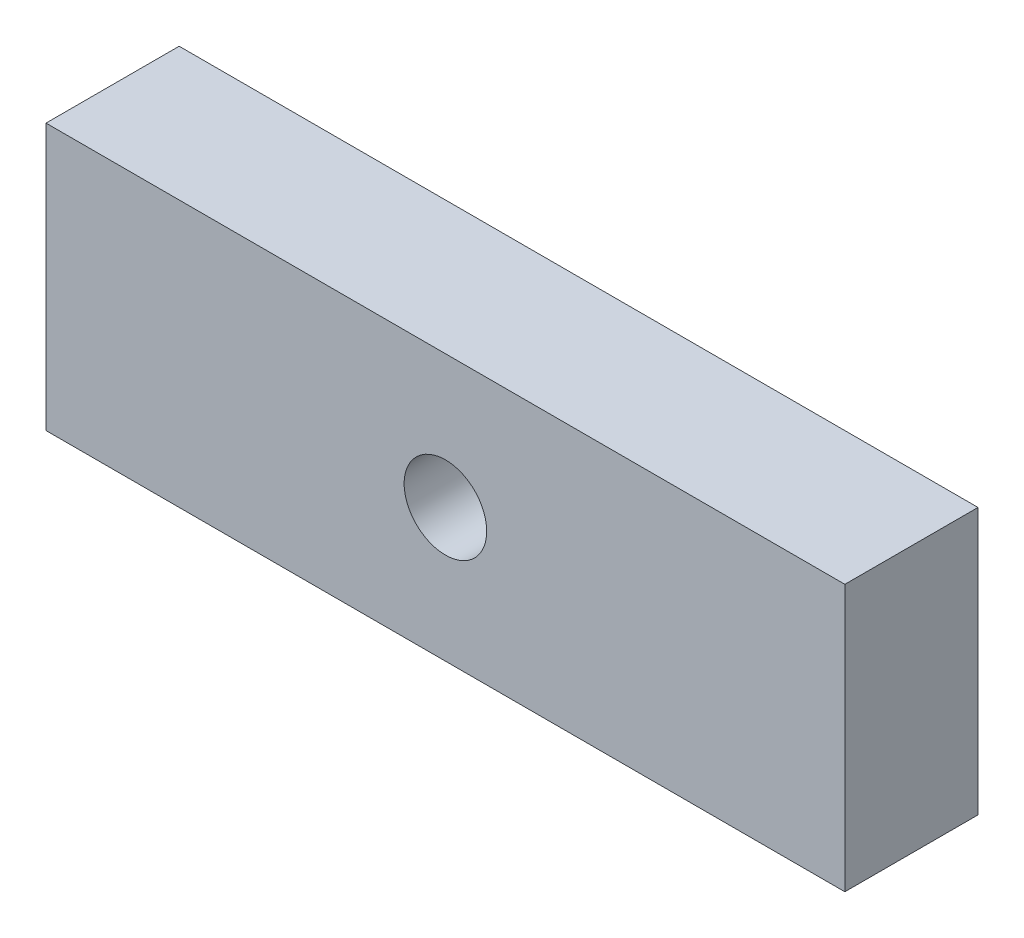
ISO-10303-21;
HEADER;
FILE_DESCRIPTION(('STEP AP214'),'2;1');
FILE_NAME('part.step','',(''),(''),'','','');
FILE_SCHEMA(('AUTOMOTIVE_DESIGN { 1 0 10303 214 1 1 1 1 }'));
ENDSEC;
DATA;
#1=APPLICATION_CONTEXT('core data for automotive mechanical design processes');
#2=APPLICATION_PROTOCOL_DEFINITION('international standard','automotive_design',2000,#1);
#3=PRODUCT_CONTEXT('',#1,'mechanical');
#4=PRODUCT('Part','Part','',(#3));
#5=PRODUCT_RELATED_PRODUCT_CATEGORY('part','',(#4));
#6=PRODUCT_DEFINITION_FORMATION('','',#4);
#7=PRODUCT_DEFINITION_CONTEXT('part definition',#1,'design');
#8=PRODUCT_DEFINITION('design','',#6,#7);
#9=PRODUCT_DEFINITION_SHAPE('','',#8);
#10=(LENGTH_UNIT() NAMED_UNIT(*) SI_UNIT(.MILLI.,.METRE.));
#11=(NAMED_UNIT(*) PLANE_ANGLE_UNIT() SI_UNIT($,.RADIAN.));
#12=(NAMED_UNIT(*) SI_UNIT($,.STERADIAN.) SOLID_ANGLE_UNIT());
#13=UNCERTAINTY_MEASURE_WITH_UNIT(LENGTH_MEASURE(1.E-05),#10,'distance_accuracy_value','');
#14=(GEOMETRIC_REPRESENTATION_CONTEXT(3) GLOBAL_UNCERTAINTY_ASSIGNED_CONTEXT((#13)) GLOBAL_UNIT_ASSIGNED_CONTEXT((#10,
#11,#12)) REPRESENTATION_CONTEXT('',''));
#15=CARTESIAN_POINT('',(0.,0.,0.));
#16=DIRECTION('',(0.,0.,1.));
#17=DIRECTION('',(1.,0.,0.));
#18=AXIS2_PLACEMENT_3D('',#15,#16,#17);
#19=CARTESIAN_POINT('',(0.,0.,10.));
#20=DIRECTION('',(0.,0.,-1.));
#21=DIRECTION('',(-1.,0.,0.));
#22=AXIS2_PLACEMENT_3D('',#19,#20,#21);
#23=PLANE('',#22);
#24=DIRECTION('',(0.,-1.,0.));
#25=VECTOR('',#24,1.);
#26=CARTESIAN_POINT('',(0.,0.,10.));
#27=LINE('',#26,#25);
#28=CARTESIAN_POINT('',(0.,20.,10.));
#29=VERTEX_POINT('',#28);
#30=CARTESIAN_POINT('',(0.,0.,10.));
#31=VERTEX_POINT('',#30);
#32=EDGE_CURVE('E91',#29,#31,#27,.T.);
#33=ORIENTED_EDGE('',*,*,#32,.T.);
#34=DIRECTION('',(1.,0.,0.));
#35=VECTOR('',#34,1.);
#36=CARTESIAN_POINT('',(0.,0.,10.));
#37=LINE('',#36,#35);
#38=CARTESIAN_POINT('',(60.,0.,10.));
#39=VERTEX_POINT('',#38);
#40=EDGE_CURVE('E86',#31,#39,#37,.T.);
#41=ORIENTED_EDGE('',*,*,#40,.T.);
#42=DIRECTION('',(0.,1.,0.));
#43=VECTOR('',#42,1.);
#44=CARTESIAN_POINT('',(60.,0.,10.));
#45=LINE('',#44,#43);
#46=CARTESIAN_POINT('',(60.,20.,10.));
#47=VERTEX_POINT('',#46);
#48=EDGE_CURVE('E87',#39,#47,#45,.T.);
#49=ORIENTED_EDGE('',*,*,#48,.T.);
#50=DIRECTION('',(-1.,0.,0.));
#51=VECTOR('',#50,1.);
#52=CARTESIAN_POINT('',(0.,20.,10.));
#53=LINE('',#52,#51);
#54=EDGE_CURVE('E57',#47,#29,#53,.T.);
#55=ORIENTED_EDGE('',*,*,#54,.T.);
#56=EDGE_LOOP('',(#33,#41,#49,#55));
#57=FACE_BOUND('',#56,.T.);
#58=CARTESIAN_POINT('',(30.,10.,10.));
#59=DIRECTION('',(0.,0.,1.));
#60=DIRECTION('',(1.,0.,0.));
#61=AXIS2_PLACEMENT_3D('',#58,#59,#60);
#62=CIRCLE('',#61,3.1);
#63=CARTESIAN_POINT('',(33.1,10.,10.));
#64=VERTEX_POINT('',#63);
#65=EDGE_CURVE('E106',#64,#64,#62,.T.);
#66=ORIENTED_EDGE('',*,*,#65,.F.);
#67=EDGE_LOOP('',(#66));
#68=FACE_BOUND('',#67,.T.);
#69=ADVANCED_FACE('F39',(#57,#68),#23,.F.);
#70=CARTESIAN_POINT('',(0.,0.,0.));
#71=DIRECTION('',(0.,0.,-1.));
#72=DIRECTION('',(-1.,0.,0.));
#73=AXIS2_PLACEMENT_3D('',#70,#71,#72);
#74=PLANE('',#73);
#75=DIRECTION('',(0.,-1.,0.));
#76=VECTOR('',#75,1.);
#77=CARTESIAN_POINT('',(0.,0.,0.));
#78=LINE('',#77,#76);
#79=CARTESIAN_POINT('',(0.,20.,0.));
#80=VERTEX_POINT('',#79);
#81=CARTESIAN_POINT('',(0.,0.,0.));
#82=VERTEX_POINT('',#81);
#83=EDGE_CURVE('E104',#80,#82,#78,.T.);
#84=ORIENTED_EDGE('',*,*,#83,.F.);
#85=DIRECTION('',(-1.,0.,0.));
#86=VECTOR('',#85,1.);
#87=CARTESIAN_POINT('',(0.,20.,0.));
#88=LINE('',#87,#86);
#89=CARTESIAN_POINT('',(60.,20.,0.));
#90=VERTEX_POINT('',#89);
#91=EDGE_CURVE('E80',#90,#80,#88,.T.);
#92=ORIENTED_EDGE('',*,*,#91,.F.);
#93=DIRECTION('',(0.,1.,0.));
#94=VECTOR('',#93,1.);
#95=CARTESIAN_POINT('',(60.,0.,0.));
#96=LINE('',#95,#94);
#97=CARTESIAN_POINT('',(60.,0.,0.));
#98=VERTEX_POINT('',#97);
#99=EDGE_CURVE('E74',#98,#90,#96,.T.);
#100=ORIENTED_EDGE('',*,*,#99,.F.);
#101=DIRECTION('',(1.,0.,0.));
#102=VECTOR('',#101,1.);
#103=CARTESIAN_POINT('',(0.,0.,0.));
#104=LINE('',#103,#102);
#105=EDGE_CURVE('E94',#82,#98,#104,.T.);
#106=ORIENTED_EDGE('',*,*,#105,.F.);
#107=EDGE_LOOP('',(#84,#92,#100,#106));
#108=FACE_BOUND('',#107,.T.);
#109=CARTESIAN_POINT('',(30.,10.,0.));
#110=DIRECTION('',(0.,0.,1.));
#111=DIRECTION('',(1.,0.,0.));
#112=AXIS2_PLACEMENT_3D('',#109,#110,#111);
#113=CIRCLE('',#112,3.1);
#114=CARTESIAN_POINT('',(33.1,10.,0.));
#115=VERTEX_POINT('',#114);
#116=EDGE_CURVE('E119',#115,#115,#113,.T.);
#117=ORIENTED_EDGE('',*,*,#116,.T.);
#118=EDGE_LOOP('',(#117));
#119=FACE_BOUND('',#118,.T.);
#120=ADVANCED_FACE('F114',(#108,#119),#74,.T.);
#121=CARTESIAN_POINT('',(0.,0.,10.));
#122=DIRECTION('',(1.,0.,0.));
#123=DIRECTION('',(0.,0.,-1.));
#124=AXIS2_PLACEMENT_3D('',#121,#122,#123);
#125=PLANE('',#124);
#126=ORIENTED_EDGE('',*,*,#83,.T.);
#127=DIRECTION('',(0.,0.,-1.));
#128=VECTOR('',#127,1.);
#129=CARTESIAN_POINT('',(0.,0.,10.));
#130=LINE('',#129,#128);
#131=EDGE_CURVE('E11',#31,#82,#130,.T.);
#132=ORIENTED_EDGE('',*,*,#131,.F.);
#133=ORIENTED_EDGE('',*,*,#32,.F.);
#134=DIRECTION('',(0.,0.,-1.));
#135=VECTOR('',#134,1.);
#136=CARTESIAN_POINT('',(0.,20.,10.));
#137=LINE('',#136,#135);
#138=EDGE_CURVE('E98',#29,#80,#137,.T.);
#139=ORIENTED_EDGE('',*,*,#138,.T.);
#140=EDGE_LOOP('',(#126,#132,#133,#139));
#141=FACE_BOUND('',#140,.T.);
#142=ADVANCED_FACE('F41',(#141),#125,.F.);
#143=CARTESIAN_POINT('',(0.,0.,10.));
#144=DIRECTION('',(0.,1.,0.));
#145=DIRECTION('',(0.,0.,1.));
#146=AXIS2_PLACEMENT_3D('',#143,#144,#145);
#147=PLANE('',#146);
#148=ORIENTED_EDGE('',*,*,#105,.T.);
#149=DIRECTION('',(0.,0.,-1.));
#150=VECTOR('',#149,1.);
#151=CARTESIAN_POINT('',(60.,0.,10.));
#152=LINE('',#151,#150);
#153=EDGE_CURVE('E48',#39,#98,#152,.T.);
#154=ORIENTED_EDGE('',*,*,#153,.F.);
#155=ORIENTED_EDGE('',*,*,#40,.F.);
#156=ORIENTED_EDGE('',*,*,#131,.T.);
#157=EDGE_LOOP('',(#148,#154,#155,#156));
#158=FACE_BOUND('',#157,.T.);
#159=ADVANCED_FACE('F92',(#158),#147,.F.);
#160=CARTESIAN_POINT('',(60.,0.,10.));
#161=DIRECTION('',(-1.,0.,0.));
#162=DIRECTION('',(0.,0.,1.));
#163=AXIS2_PLACEMENT_3D('',#160,#161,#162);
#164=PLANE('',#163);
#165=ORIENTED_EDGE('',*,*,#99,.T.);
#166=DIRECTION('',(0.,0.,-1.));
#167=VECTOR('',#166,1.);
#168=CARTESIAN_POINT('',(60.,20.,10.));
#169=LINE('',#168,#167);
#170=EDGE_CURVE('E96',#47,#90,#169,.T.);
#171=ORIENTED_EDGE('',*,*,#170,.F.);
#172=ORIENTED_EDGE('',*,*,#48,.F.);
#173=ORIENTED_EDGE('',*,*,#153,.T.);
#174=EDGE_LOOP('',(#165,#171,#172,#173));
#175=FACE_BOUND('',#174,.T.);
#176=ADVANCED_FACE('F100',(#175),#164,.F.);
#177=CARTESIAN_POINT('',(0.,20.,10.));
#178=DIRECTION('',(0.,-1.,0.));
#179=DIRECTION('',(0.,0.,-1.));
#180=AXIS2_PLACEMENT_3D('',#177,#178,#179);
#181=PLANE('',#180);
#182=ORIENTED_EDGE('',*,*,#91,.T.);
#183=ORIENTED_EDGE('',*,*,#138,.F.);
#184=ORIENTED_EDGE('',*,*,#54,.F.);
#185=ORIENTED_EDGE('',*,*,#170,.T.);
#186=EDGE_LOOP('',(#182,#183,#184,#185));
#187=FACE_BOUND('',#186,.T.);
#188=ADVANCED_FACE('F112',(#187),#181,.F.);
#189=CARTESIAN_POINT('',(30.,10.,10.));
#190=DIRECTION('',(0.,0.,-1.));
#191=DIRECTION('',(-1.,0.,0.));
#192=AXIS2_PLACEMENT_3D('',#189,#190,#191);
#193=CYLINDRICAL_SURFACE('',#192,3.1);
#194=ORIENTED_EDGE('',*,*,#65,.T.);
#195=EDGE_LOOP('',(#194));
#196=FACE_BOUND('',#195,.T.);
#197=ORIENTED_EDGE('',*,*,#116,.F.);
#198=EDGE_LOOP('',(#197));
#199=FACE_BOUND('',#198,.T.);
#200=ADVANCED_FACE('F125',(#196,#199),#193,.F.);
#201=CLOSED_SHELL('',(#69,#120,#142,#159,#176,#188,#200));
#202=MANIFOLD_SOLID_BREP('B2',#201);
#203=ADVANCED_BREP_SHAPE_REPRESENTATION('',(#18,#202),#14);
#204=SHAPE_DEFINITION_REPRESENTATION(#9,#203);
ENDSEC;
END-ISO-10303-21;
